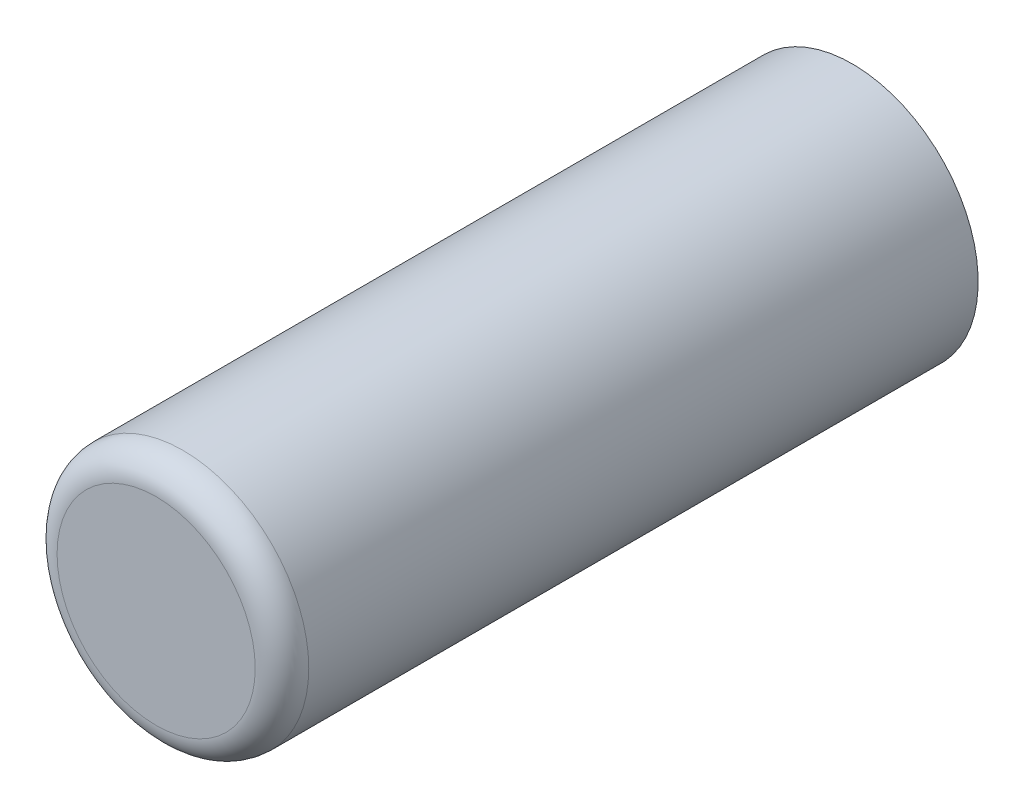
ISO-10303-21;
HEADER;
FILE_DESCRIPTION(('STEP AP214'),'2;1');
FILE_NAME('part.step','',(''),(''),'','','');
FILE_SCHEMA(('AUTOMOTIVE_DESIGN { 1 0 10303 214 1 1 1 1 }'));
ENDSEC;
DATA;
#1=APPLICATION_CONTEXT('core data for automotive mechanical design processes');
#2=APPLICATION_PROTOCOL_DEFINITION('international standard','automotive_design',2000,#1);
#3=PRODUCT_CONTEXT('',#1,'mechanical');
#4=PRODUCT('Part','Part','',(#3));
#5=PRODUCT_RELATED_PRODUCT_CATEGORY('part','',(#4));
#6=PRODUCT_DEFINITION_FORMATION('','',#4);
#7=PRODUCT_DEFINITION_CONTEXT('part definition',#1,'design');
#8=PRODUCT_DEFINITION('design','',#6,#7);
#9=PRODUCT_DEFINITION_SHAPE('','',#8);
#10=(LENGTH_UNIT() NAMED_UNIT(*) SI_UNIT(.MILLI.,.METRE.));
#11=(NAMED_UNIT(*) PLANE_ANGLE_UNIT() SI_UNIT($,.RADIAN.));
#12=(NAMED_UNIT(*) SI_UNIT($,.STERADIAN.) SOLID_ANGLE_UNIT());
#13=UNCERTAINTY_MEASURE_WITH_UNIT(LENGTH_MEASURE(1.E-05),#10,'distance_accuracy_value','');
#14=(GEOMETRIC_REPRESENTATION_CONTEXT(3) GLOBAL_UNCERTAINTY_ASSIGNED_CONTEXT((#13)) GLOBAL_UNIT_ASSIGNED_CONTEXT((#10,
#11,#12)) REPRESENTATION_CONTEXT('',''));
#15=CARTESIAN_POINT('',(0.,0.,0.));
#16=DIRECTION('',(0.,0.,1.));
#17=DIRECTION('',(1.,0.,0.));
#18=AXIS2_PLACEMENT_3D('',#15,#16,#17);
#19=CARTESIAN_POINT('',(0.,0.,13.));
#20=DIRECTION('',(0.,0.,-1.));
#21=DIRECTION('',(-1.,0.,0.));
#22=AXIS2_PLACEMENT_3D('',#19,#20,#21);
#23=CYLINDRICAL_SURFACE('',#22,2.35);
#24=CARTESIAN_POINT('',(0.,0.,12.5));
#25=DIRECTION('',(0.,0.,1.));
#26=DIRECTION('',(1.,0.,0.));
#27=AXIS2_PLACEMENT_3D('',#24,#25,#26);
#28=CIRCLE('',#27,2.35);
#29=CARTESIAN_POINT('',(-2.35,0.,12.5));
#30=VERTEX_POINT('',#29);
#31=EDGE_CURVE('E10',#30,#30,#28,.F.);
#32=CARTESIAN_POINT('',(0.,0.,0.));
#33=DIRECTION('',(0.,0.,1.));
#34=DIRECTION('',(1.,0.,0.));
#35=AXIS2_PLACEMENT_3D('',#32,#33,#34);
#36=CIRCLE('',#35,2.35);
#37=CARTESIAN_POINT('',(-2.35,0.,0.));
#38=VERTEX_POINT('',#37);
#39=EDGE_CURVE('E53',#38,#38,#36,.T.);
#40=CARTESIAN_POINT('',(-2.35,0.,12.5));
#41=CARTESIAN_POINT('',(-2.35,0.,12.3697916666667));
#42=CARTESIAN_POINT('',(-2.35,0.,12.2395833333333));
#43=CARTESIAN_POINT('',(-2.35,0.,11.9791666666667));
#44=CARTESIAN_POINT('',(-2.35,0.,11.8489583333333));
#45=CARTESIAN_POINT('',(-2.35,0.,11.5885416666667));
#46=CARTESIAN_POINT('',(-2.35,0.,11.4583333333333));
#47=CARTESIAN_POINT('',(-2.35,0.,11.1979166666667));
#48=CARTESIAN_POINT('',(-2.35,0.,11.0677083333333));
#49=CARTESIAN_POINT('',(-2.35,0.,10.8072916666667));
#50=CARTESIAN_POINT('',(-2.35,0.,10.6770833333333));
#51=CARTESIAN_POINT('',(-2.35,0.,10.4166666666667));
#52=CARTESIAN_POINT('',(-2.35,0.,10.2864583333333));
#53=CARTESIAN_POINT('',(-2.35,0.,10.0260416666667));
#54=CARTESIAN_POINT('',(-2.35,0.,9.89583333333333));
#55=CARTESIAN_POINT('',(-2.35,0.,9.63541666666667));
#56=CARTESIAN_POINT('',(-2.35,0.,9.50520833333333));
#57=CARTESIAN_POINT('',(-2.35,0.,9.24479166666666));
#58=CARTESIAN_POINT('',(-2.35,0.,9.11458333333333));
#59=CARTESIAN_POINT('',(-2.35,0.,8.85416666666667));
#60=CARTESIAN_POINT('',(-2.35,0.,8.72395833333333));
#61=CARTESIAN_POINT('',(-2.35,0.,8.46354166666667));
#62=CARTESIAN_POINT('',(-2.35,0.,8.33333333333333));
#63=CARTESIAN_POINT('',(-2.35,0.,8.07291666666667));
#64=CARTESIAN_POINT('',(-2.35,0.,7.94270833333333));
#65=CARTESIAN_POINT('',(-2.35,0.,7.68229166666667));
#66=CARTESIAN_POINT('',(-2.35,0.,7.55208333333333));
#67=CARTESIAN_POINT('',(-2.35,0.,7.29166666666667));
#68=CARTESIAN_POINT('',(-2.35,0.,7.16145833333333));
#69=CARTESIAN_POINT('',(-2.35,0.,6.90104166666667));
#70=CARTESIAN_POINT('',(-2.35,0.,6.77083333333333));
#71=CARTESIAN_POINT('',(-2.35,0.,6.51041666666667));
#72=CARTESIAN_POINT('',(-2.35,0.,6.38020833333333));
#73=CARTESIAN_POINT('',(-2.35,0.,6.11979166666667));
#74=CARTESIAN_POINT('',(-2.35,0.,5.98958333333333));
#75=CARTESIAN_POINT('',(-2.35,0.,5.72916666666667));
#76=CARTESIAN_POINT('',(-2.35,0.,5.59895833333333));
#77=CARTESIAN_POINT('',(-2.35,0.,5.33854166666667));
#78=CARTESIAN_POINT('',(-2.35,0.,5.20833333333333));
#79=CARTESIAN_POINT('',(-2.35,0.,4.94791666666667));
#80=CARTESIAN_POINT('',(-2.35,0.,4.81770833333333));
#81=CARTESIAN_POINT('',(-2.35,0.,4.55729166666667));
#82=CARTESIAN_POINT('',(-2.35,0.,4.42708333333333));
#83=CARTESIAN_POINT('',(-2.35,0.,4.16666666666667));
#84=CARTESIAN_POINT('',(-2.35,0.,4.03645833333333));
#85=CARTESIAN_POINT('',(-2.35,0.,3.77604166666667));
#86=CARTESIAN_POINT('',(-2.35,0.,3.64583333333333));
#87=CARTESIAN_POINT('',(-2.35,0.,3.38541666666667));
#88=CARTESIAN_POINT('',(-2.35,0.,3.25520833333333));
#89=CARTESIAN_POINT('',(-2.35,0.,2.99479166666667));
#90=CARTESIAN_POINT('',(-2.35,0.,2.86458333333333));
#91=CARTESIAN_POINT('',(-2.35,0.,2.60416666666667));
#92=CARTESIAN_POINT('',(-2.35,0.,2.47395833333333));
#93=CARTESIAN_POINT('',(-2.35,0.,2.21354166666667));
#94=CARTESIAN_POINT('',(-2.35,0.,2.08333333333333));
#95=CARTESIAN_POINT('',(-2.35,0.,1.82291666666667));
#96=CARTESIAN_POINT('',(-2.35,0.,1.69270833333333));
#97=CARTESIAN_POINT('',(-2.35,0.,1.43229166666666));
#98=CARTESIAN_POINT('',(-2.35,0.,1.30208333333333));
#99=CARTESIAN_POINT('',(-2.35,0.,1.04166666666667));
#100=CARTESIAN_POINT('',(-2.35,0.,0.911458333333334));
#101=CARTESIAN_POINT('',(-2.35,0.,0.651041666666667));
#102=CARTESIAN_POINT('',(-2.35,0.,0.520833333333333));
#103=CARTESIAN_POINT('',(-2.35,0.,0.260416666666666));
#104=CARTESIAN_POINT('',(-2.35,0.,0.130208333333333));
#105=CARTESIAN_POINT('',(-2.35,0.,0.));
#106=B_SPLINE_CURVE_WITH_KNOTS('',3,(#40,#41,#42,#43,#44,#45,#46,#47,#48,#49,#50,#51,#52,#53,
#54,#55,#56,#57,#58,#59,#60,#61,#62,#63,#64,#65,#66,#67,#68,#69,#70,#71,#72,#73,#74,#75,#76,#77,
#78,#79,#80,#81,#82,#83,#84,#85,#86,#87,#88,#89,#90,#91,#92,#93,#94,#95,#96,#97,#98,#99,#100,
#101,#102,#103,#104,#105),.UNSPECIFIED.,.F.,.F.,(4,2,2,2,2,2,2,2,2,2,2,2,2,2,2,2,2,2,2,2,2,2,2,
2,2,2,2,2,2,2,2,2,4),(0.,0.390625,0.781250000000001,1.171875,1.5625,1.953125,2.34375,2.734375,
3.125,3.515625,3.90625,4.296875,4.6875,5.078125,5.46875,5.859375,6.25,6.640625,7.03125,7.421875,
7.8125,8.203125,8.59375,8.984375,9.375,9.765625,10.15625,10.546875,10.9375,11.328125,11.71875,
12.109375,12.5),.UNSPECIFIED.);
#107=EDGE_CURVE('BSEAM40',#30,#38,#106,.T.);
#108=ORIENTED_EDGE('',*,*,#31,.T.);
#109=ORIENTED_EDGE('',*,*,#39,.T.);
#110=ORIENTED_EDGE('',*,*,#107,.T.);
#111=ORIENTED_EDGE('',*,*,#107,.F.);
#112=EDGE_LOOP('',(#108,#110,#109,#111));
#113=FACE_BOUND('',#112,.T.);
#114=ADVANCED_FACE('F40',(#113),#23,.T.);
#115=CARTESIAN_POINT('',(0.,0.,13.));
#116=DIRECTION('',(0.,0.,1.));
#117=DIRECTION('',(1.,0.,0.));
#118=AXIS2_PLACEMENT_3D('',#115,#116,#117);
#119=PLANE('',#118);
#120=CARTESIAN_POINT('',(0.,0.,13.));
#121=DIRECTION('',(0.,0.,1.));
#122=DIRECTION('',(1.,0.,0.));
#123=AXIS2_PLACEMENT_3D('',#120,#121,#122);
#124=CIRCLE('',#123,1.85);
#125=CARTESIAN_POINT('',(1.85,0.,13.));
#126=VERTEX_POINT('',#125);
#127=EDGE_CURVE('E48',#126,#126,#124,.T.);
#128=ORIENTED_EDGE('',*,*,#127,.T.);
#129=EDGE_LOOP('',(#128));
#130=FACE_BOUND('',#129,.T.);
#131=ADVANCED_FACE('F64',(#130),#119,.T.);
#132=CARTESIAN_POINT('',(0.,0.,0.));
#133=DIRECTION('',(0.,0.,1.));
#134=DIRECTION('',(1.,0.,0.));
#135=AXIS2_PLACEMENT_3D('',#132,#133,#134);
#136=PLANE('',#135);
#137=ORIENTED_EDGE('',*,*,#39,.F.);
#138=EDGE_LOOP('',(#137));
#139=FACE_BOUND('',#138,.T.);
#140=ADVANCED_FACE('F62',(#139),#136,.F.);
#141=CARTESIAN_POINT('',(0.,0.,12.5));
#142=DIRECTION('',(0.,0.,1.));
#143=DIRECTION('',(1.,0.,0.));
#144=AXIS2_PLACEMENT_3D('',#141,#142,#143);
#145=TOROIDAL_SURFACE('',#144,1.85,0.5);
#146=ORIENTED_EDGE('',*,*,#31,.F.);
#147=EDGE_LOOP('',(#146));
#148=FACE_BOUND('',#147,.T.);
#149=ORIENTED_EDGE('',*,*,#127,.F.);
#150=EDGE_LOOP('',(#149));
#151=FACE_BOUND('',#150,.T.);
#152=ADVANCED_FACE('F42',(#148,#151),#145,.T.);
#153=CLOSED_SHELL('',(#114,#131,#140,#152));
#154=MANIFOLD_SOLID_BREP('B2',#153);
#155=ADVANCED_BREP_SHAPE_REPRESENTATION('',(#18,#154),#14);
#156=SHAPE_DEFINITION_REPRESENTATION(#9,#155);
ENDSEC;
END-ISO-10303-21;
